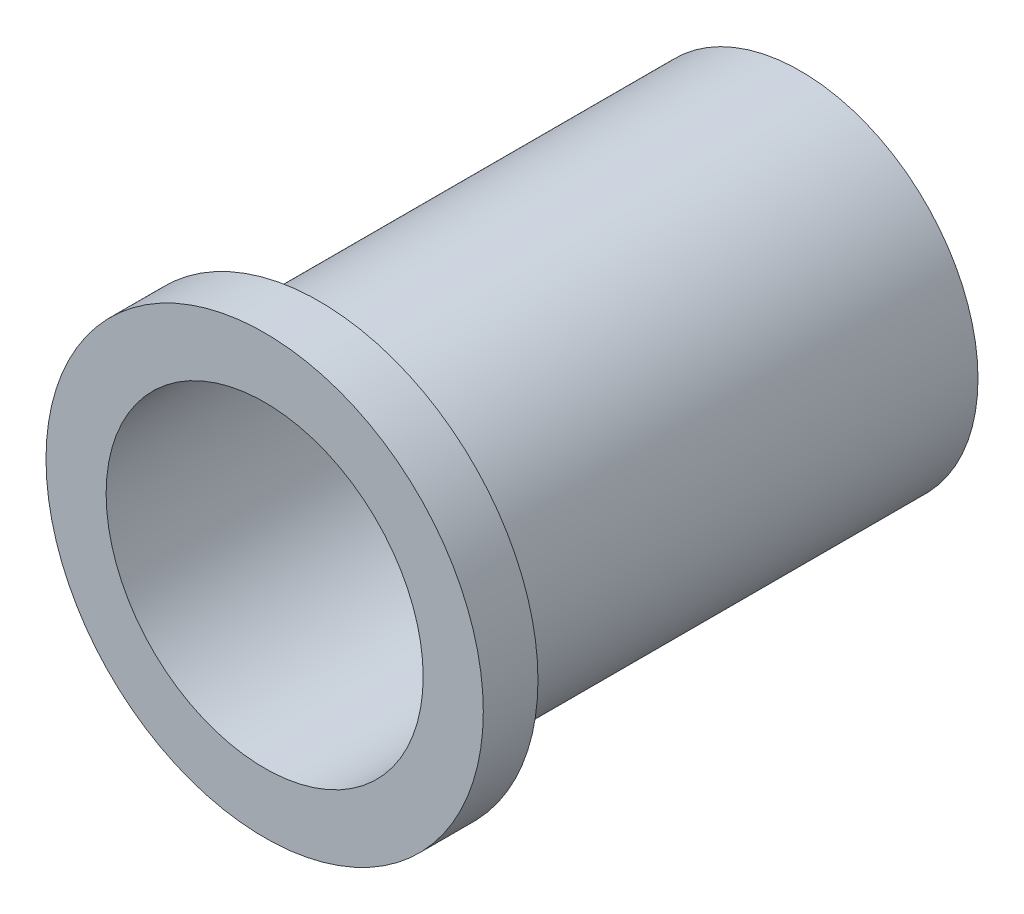
ISO-10303-21;
HEADER;
FILE_DESCRIPTION(('STEP AP214'),'2;1');
FILE_NAME('part.step','',(''),(''),'','','');
FILE_SCHEMA(('AUTOMOTIVE_DESIGN { 1 0 10303 214 1 1 1 1 }'));
ENDSEC;
DATA;
#1=APPLICATION_CONTEXT('core data for automotive mechanical design processes');
#2=APPLICATION_PROTOCOL_DEFINITION('international standard','automotive_design',2000,#1);
#3=PRODUCT_CONTEXT('',#1,'mechanical');
#4=PRODUCT('Part','Part','',(#3));
#5=PRODUCT_RELATED_PRODUCT_CATEGORY('part','',(#4));
#6=PRODUCT_DEFINITION_FORMATION('','',#4);
#7=PRODUCT_DEFINITION_CONTEXT('part definition',#1,'design');
#8=PRODUCT_DEFINITION('design','',#6,#7);
#9=PRODUCT_DEFINITION_SHAPE('','',#8);
#10=(LENGTH_UNIT() NAMED_UNIT(*) SI_UNIT(.MILLI.,.METRE.));
#11=(NAMED_UNIT(*) PLANE_ANGLE_UNIT() SI_UNIT($,.RADIAN.));
#12=(NAMED_UNIT(*) SI_UNIT($,.STERADIAN.) SOLID_ANGLE_UNIT());
#13=UNCERTAINTY_MEASURE_WITH_UNIT(LENGTH_MEASURE(1.E-05),#10,'distance_accuracy_value','');
#14=(GEOMETRIC_REPRESENTATION_CONTEXT(3) GLOBAL_UNCERTAINTY_ASSIGNED_CONTEXT((#13)) GLOBAL_UNIT_ASSIGNED_CONTEXT((#10,
#11,#12)) REPRESENTATION_CONTEXT('',''));
#15=CARTESIAN_POINT('',(0.,0.,0.));
#16=DIRECTION('',(0.,0.,1.));
#17=DIRECTION('',(1.,0.,0.));
#18=AXIS2_PLACEMENT_3D('',#15,#16,#17);
#19=CARTESIAN_POINT('',(15.20322785645,14.196461829005,-1.7));
#20=DIRECTION('',(0.,0.,1.));
#21=DIRECTION('',(1.,0.,0.));
#22=AXIS2_PLACEMENT_3D('',#19,#20,#21);
#23=PLANE('',#22);
#24=CARTESIAN_POINT('',(12.30322785645,14.196461829005,-1.7));
#25=DIRECTION('',(0.,0.,-1.));
#26=DIRECTION('',(-1.,0.,0.));
#27=AXIS2_PLACEMENT_3D('',#24,#25,#26);
#28=CIRCLE('',#27,1.6);
#29=CARTESIAN_POINT('',(10.70322785645,14.196461829005,-1.7));
#30=VERTEX_POINT('',#29);
#31=EDGE_CURVE('E10',#30,#30,#28,.T.);
#32=ORIENTED_EDGE('',*,*,#31,.T.);
#33=EDGE_LOOP('',(#32));
#34=FACE_BOUND('',#33,.T.);
#35=CARTESIAN_POINT('',(12.30322785645,14.196461829005,-1.7));
#36=DIRECTION('',(0.,0.,-1.));
#37=DIRECTION('',(-1.,0.,0.));
#38=AXIS2_PLACEMENT_3D('',#35,#36,#37);
#39=CIRCLE('',#38,2.9);
#40=CARTESIAN_POINT('',(9.40322785645,14.196461829005,-1.7));
#41=VERTEX_POINT('',#40);
#42=EDGE_CURVE('E63',#41,#41,#39,.T.);
#43=ORIENTED_EDGE('',*,*,#42,.F.);
#44=EDGE_LOOP('',(#43));
#45=FACE_BOUND('',#44,.T.);
#46=ADVANCED_FACE('F35',(#34,#45),#23,.T.);
#47=CARTESIAN_POINT('',(12.30322785645,14.196461829005,5.));
#48=DIRECTION('',(0.,0.,-1.));
#49=DIRECTION('',(-1.,0.,0.));
#50=AXIS2_PLACEMENT_3D('',#47,#48,#49);
#51=CYLINDRICAL_SURFACE('',#50,1.6);
#52=CARTESIAN_POINT('',(12.30322785645,14.196461829005,-7.));
#53=DIRECTION('',(0.,0.,-1.));
#54=DIRECTION('',(-1.,0.,0.));
#55=AXIS2_PLACEMENT_3D('',#52,#53,#54);
#56=CIRCLE('',#55,1.6);
#57=CARTESIAN_POINT('',(10.70322785645,14.196461829005,-7.));
#58=VERTEX_POINT('',#57);
#59=EDGE_CURVE('E41',#58,#58,#56,.T.);
#60=ORIENTED_EDGE('',*,*,#59,.T.);
#61=EDGE_LOOP('',(#60));
#62=FACE_BOUND('',#61,.T.);
#63=ORIENTED_EDGE('',*,*,#31,.F.);
#64=EDGE_LOOP('',(#63));
#65=FACE_BOUND('',#64,.T.);
#66=ADVANCED_FACE('F71',(#62,#65),#51,.F.);
#67=CARTESIAN_POINT('',(13.90322785645,14.196461829005,-7.));
#68=DIRECTION('',(0.,0.,-1.));
#69=DIRECTION('',(-1.,0.,0.));
#70=AXIS2_PLACEMENT_3D('',#67,#68,#69);
#71=PLANE('',#70);
#72=CARTESIAN_POINT('',(12.30322785645,14.196461829005,-7.));
#73=DIRECTION('',(0.,0.,-1.));
#74=DIRECTION('',(-1.,0.,0.));
#75=AXIS2_PLACEMENT_3D('',#72,#73,#74);
#76=CIRCLE('',#75,3.25);
#77=CARTESIAN_POINT('',(9.05322785645,14.196461829005,-7.));
#78=VERTEX_POINT('',#77);
#79=EDGE_CURVE('E45',#78,#78,#76,.T.);
#80=ORIENTED_EDGE('',*,*,#79,.T.);
#81=EDGE_LOOP('',(#80));
#82=FACE_BOUND('',#81,.T.);
#83=ORIENTED_EDGE('',*,*,#59,.F.);
#84=EDGE_LOOP('',(#83));
#85=FACE_BOUND('',#84,.T.);
#86=ADVANCED_FACE('F75',(#82,#85),#71,.T.);
#87=CARTESIAN_POINT('',(12.30322785645,14.196461829005,5.));
#88=DIRECTION('',(0.,0.,-1.));
#89=DIRECTION('',(-1.,0.,0.));
#90=AXIS2_PLACEMENT_3D('',#87,#88,#89);
#91=CYLINDRICAL_SURFACE('',#90,3.25);
#92=CARTESIAN_POINT('',(12.30322785645,14.196461829005,1.8));
#93=DIRECTION('',(0.,0.,-1.));
#94=DIRECTION('',(-1.,0.,0.));
#95=AXIS2_PLACEMENT_3D('',#92,#93,#94);
#96=CIRCLE('',#95,3.25);
#97=CARTESIAN_POINT('',(9.05322785645,14.196461829005,1.8));
#98=VERTEX_POINT('',#97);
#99=EDGE_CURVE('E49',#98,#98,#96,.T.);
#100=ORIENTED_EDGE('',*,*,#99,.T.);
#101=EDGE_LOOP('',(#100));
#102=FACE_BOUND('',#101,.T.);
#103=ORIENTED_EDGE('',*,*,#79,.F.);
#104=EDGE_LOOP('',(#103));
#105=FACE_BOUND('',#104,.T.);
#106=ADVANCED_FACE('F79',(#102,#105),#91,.T.);
#107=CARTESIAN_POINT('',(15.55322785645,14.196461829005,1.8));
#108=DIRECTION('',(0.,0.,-1.));
#109=DIRECTION('',(-1.,0.,0.));
#110=AXIS2_PLACEMENT_3D('',#107,#108,#109);
#111=PLANE('',#110);
#112=CARTESIAN_POINT('',(12.30322785645,14.196461829005,1.8));
#113=DIRECTION('',(0.,0.,-1.));
#114=DIRECTION('',(-1.,0.,0.));
#115=AXIS2_PLACEMENT_3D('',#112,#113,#114);
#116=CIRCLE('',#115,4.);
#117=CARTESIAN_POINT('',(8.30322785645,14.196461829005,1.8));
#118=VERTEX_POINT('',#117);
#119=EDGE_CURVE('E54',#118,#118,#116,.T.);
#120=ORIENTED_EDGE('',*,*,#119,.T.);
#121=EDGE_LOOP('',(#120));
#122=FACE_BOUND('',#121,.T.);
#123=ORIENTED_EDGE('',*,*,#99,.F.);
#124=EDGE_LOOP('',(#123));
#125=FACE_BOUND('',#124,.T.);
#126=ADVANCED_FACE('F86',(#122,#125),#111,.T.);
#127=CARTESIAN_POINT('',(12.30322785645,14.196461829005,5.));
#128=DIRECTION('',(0.,0.,-1.));
#129=DIRECTION('',(-1.,0.,0.));
#130=AXIS2_PLACEMENT_3D('',#127,#128,#129);
#131=CYLINDRICAL_SURFACE('',#130,4.);
#132=CARTESIAN_POINT('',(12.30322785645,14.196461829005,2.8));
#133=DIRECTION('',(0.,0.,-1.));
#134=DIRECTION('',(-1.,0.,0.));
#135=AXIS2_PLACEMENT_3D('',#132,#133,#134);
#136=CIRCLE('',#135,4.);
#137=CARTESIAN_POINT('',(8.30322785645,14.196461829005,2.8));
#138=VERTEX_POINT('',#137);
#139=EDGE_CURVE('E57',#138,#138,#136,.T.);
#140=ORIENTED_EDGE('',*,*,#139,.T.);
#141=EDGE_LOOP('',(#140));
#142=FACE_BOUND('',#141,.T.);
#143=ORIENTED_EDGE('',*,*,#119,.F.);
#144=EDGE_LOOP('',(#143));
#145=FACE_BOUND('',#144,.T.);
#146=ADVANCED_FACE('F90',(#142,#145),#131,.T.);
#147=CARTESIAN_POINT('',(16.30322785645,14.196461829005,2.8));
#148=DIRECTION('',(0.,0.,1.));
#149=DIRECTION('',(1.,0.,0.));
#150=AXIS2_PLACEMENT_3D('',#147,#148,#149);
#151=PLANE('',#150);
#152=CARTESIAN_POINT('',(12.30322785645,14.196461829005,2.8));
#153=DIRECTION('',(0.,0.,-1.));
#154=DIRECTION('',(-1.,0.,0.));
#155=AXIS2_PLACEMENT_3D('',#152,#153,#154);
#156=CIRCLE('',#155,2.9);
#157=CARTESIAN_POINT('',(9.40322785645,14.196461829005,2.8));
#158=VERTEX_POINT('',#157);
#159=EDGE_CURVE('E60',#158,#158,#156,.T.);
#160=ORIENTED_EDGE('',*,*,#159,.T.);
#161=EDGE_LOOP('',(#160));
#162=FACE_BOUND('',#161,.T.);
#163=ORIENTED_EDGE('',*,*,#139,.F.);
#164=EDGE_LOOP('',(#163));
#165=FACE_BOUND('',#164,.T.);
#166=ADVANCED_FACE('F94',(#162,#165),#151,.T.);
#167=CARTESIAN_POINT('',(12.30322785645,14.196461829005,5.));
#168=DIRECTION('',(0.,0.,-1.));
#169=DIRECTION('',(-1.,0.,0.));
#170=AXIS2_PLACEMENT_3D('',#167,#168,#169);
#171=CYLINDRICAL_SURFACE('',#170,2.9);
#172=ORIENTED_EDGE('',*,*,#42,.T.);
#173=EDGE_LOOP('',(#172));
#174=FACE_BOUND('',#173,.T.);
#175=ORIENTED_EDGE('',*,*,#159,.F.);
#176=EDGE_LOOP('',(#175));
#177=FACE_BOUND('',#176,.T.);
#178=ADVANCED_FACE('F67',(#174,#177),#171,.F.);
#179=CLOSED_SHELL('',(#46,#66,#86,#106,#126,#146,#166,#178));
#180=MANIFOLD_SOLID_BREP('B2',#179);
#181=ADVANCED_BREP_SHAPE_REPRESENTATION('',(#18,#180),#14);
#182=SHAPE_DEFINITION_REPRESENTATION(#9,#181);
ENDSEC;
END-ISO-10303-21;
